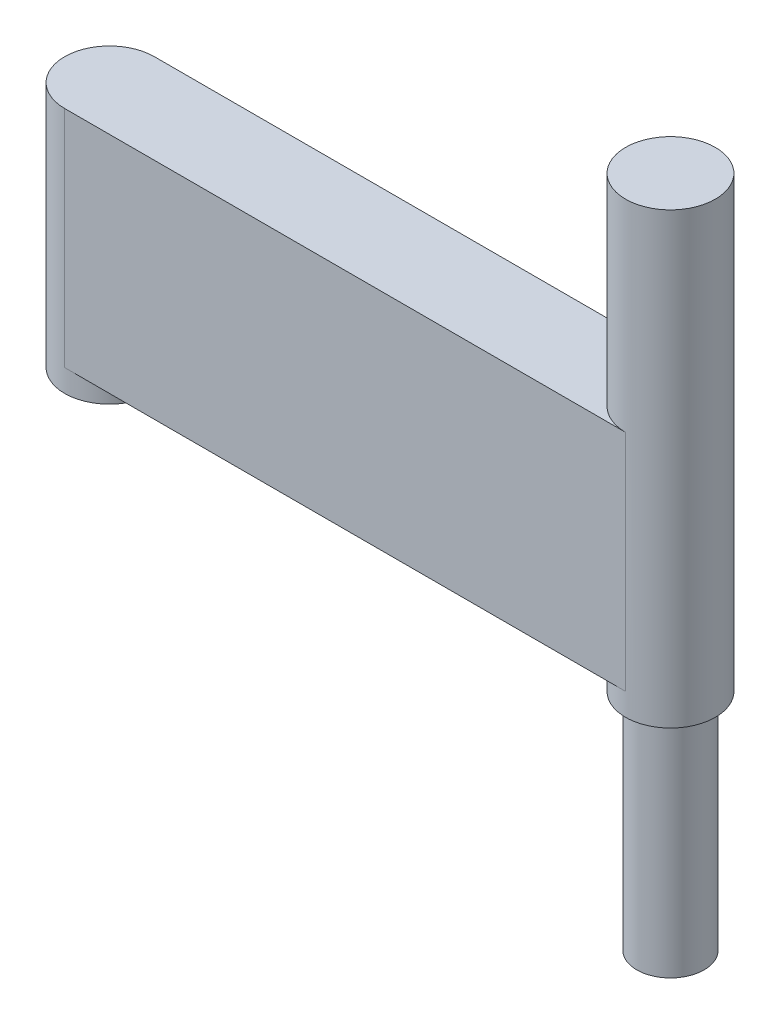
ISO-10303-21;
HEADER;
FILE_DESCRIPTION(('STEP AP214'),'2;1');
FILE_NAME('part.step','',(''),(''),'','','');
FILE_SCHEMA(('AUTOMOTIVE_DESIGN { 1 0 10303 214 1 1 1 1 }'));
ENDSEC;
DATA;
#1=APPLICATION_CONTEXT('core data for automotive mechanical design processes');
#2=APPLICATION_PROTOCOL_DEFINITION('international standard','automotive_design',2000,#1);
#3=PRODUCT_CONTEXT('',#1,'mechanical');
#4=PRODUCT('Part','Part','',(#3));
#5=PRODUCT_RELATED_PRODUCT_CATEGORY('part','',(#4));
#6=PRODUCT_DEFINITION_FORMATION('','',#4);
#7=PRODUCT_DEFINITION_CONTEXT('part definition',#1,'design');
#8=PRODUCT_DEFINITION('design','',#6,#7);
#9=PRODUCT_DEFINITION_SHAPE('','',#8);
#10=(LENGTH_UNIT() NAMED_UNIT(*) SI_UNIT(.MILLI.,.METRE.));
#11=(NAMED_UNIT(*) PLANE_ANGLE_UNIT() SI_UNIT($,.RADIAN.));
#12=(NAMED_UNIT(*) SI_UNIT($,.STERADIAN.) SOLID_ANGLE_UNIT());
#13=UNCERTAINTY_MEASURE_WITH_UNIT(LENGTH_MEASURE(1.E-05),#10,'distance_accuracy_value','');
#14=(GEOMETRIC_REPRESENTATION_CONTEXT(3) GLOBAL_UNCERTAINTY_ASSIGNED_CONTEXT((#13)) GLOBAL_UNIT_ASSIGNED_CONTEXT((#10,
#11,#12)) REPRESENTATION_CONTEXT('',''));
#15=CARTESIAN_POINT('',(0.,0.,0.));
#16=DIRECTION('',(0.,0.,1.));
#17=DIRECTION('',(1.,0.,0.));
#18=AXIS2_PLACEMENT_3D('',#15,#16,#17);
#19=CARTESIAN_POINT('',(0.,10.,0.));
#20=DIRECTION('',(0.,1.,0.));
#21=DIRECTION('',(0.,0.,1.));
#22=AXIS2_PLACEMENT_3D('',#19,#20,#21);
#23=PLANE('',#22);
#24=CARTESIAN_POINT('',(250.,10.,0.));
#25=DIRECTION('',(0.,-1.,0.));
#26=DIRECTION('',(0.,0.,-1.));
#27=AXIS2_PLACEMENT_3D('',#24,#25,#26);
#28=CIRCLE('',#27,20.);
#29=CARTESIAN_POINT('',(250.,10.,20.));
#30=VERTEX_POINT('',#29);
#31=CARTESIAN_POINT('',(250.,10.,-20.));
#32=VERTEX_POINT('',#31);
#33=EDGE_CURVE('E80',#30,#32,#28,.T.);
#34=ORIENTED_EDGE('',*,*,#33,.F.);
#35=DIRECTION('',(1.,0.,0.));
#36=VECTOR('',#35,1.);
#37=CARTESIAN_POINT('',(0.,10.,20.));
#38=LINE('',#37,#36);
#39=CARTESIAN_POINT('',(0.,10.,20.));
#40=VERTEX_POINT('',#39);
#41=EDGE_CURVE('E94',#40,#30,#38,.T.);
#42=ORIENTED_EDGE('',*,*,#41,.F.);
#43=CARTESIAN_POINT('',(0.,10.,0.));
#44=DIRECTION('',(0.,1.,0.));
#45=DIRECTION('',(0.,0.,1.));
#46=AXIS2_PLACEMENT_3D('',#43,#44,#45);
#47=CIRCLE('',#46,20.);
#48=CARTESIAN_POINT('',(0.,10.,-20.));
#49=VERTEX_POINT('',#48);
#50=EDGE_CURVE('E57',#40,#49,#47,.T.);
#51=ORIENTED_EDGE('',*,*,#50,.T.);
#52=DIRECTION('',(-1.,0.,0.));
#53=VECTOR('',#52,1.);
#54=CARTESIAN_POINT('',(0.,10.,-20.));
#55=LINE('',#54,#53);
#56=EDGE_CURVE('E121',#32,#49,#55,.T.);
#57=ORIENTED_EDGE('',*,*,#56,.F.);
#58=EDGE_LOOP('',(#34,#42,#51,#57));
#59=FACE_BOUND('',#58,.T.);
#60=ADVANCED_FACE('F39',(#59),#23,.F.);
#61=CARTESIAN_POINT('',(0.,10.,0.));
#62=DIRECTION('',(0.,-1.,0.));
#63=DIRECTION('',(0.,0.,-1.));
#64=AXIS2_PLACEMENT_3D('',#61,#62,#63);
#65=CYLINDRICAL_SURFACE('',#64,20.);
#66=ORIENTED_EDGE('',*,*,#50,.F.);
#67=DIRECTION('',(0.,-1.,0.));
#68=VECTOR('',#67,1.);
#69=CARTESIAN_POINT('',(0.,110.,20.));
#70=LINE('',#69,#68);
#71=CARTESIAN_POINT('',(0.,110.,20.));
#72=VERTEX_POINT('',#71);
#73=EDGE_CURVE('E97',#72,#40,#70,.T.);
#74=ORIENTED_EDGE('',*,*,#73,.F.);
#75=CARTESIAN_POINT('',(0.,110.,0.));
#76=DIRECTION('',(0.,1.,0.));
#77=DIRECTION('',(0.,0.,1.));
#78=AXIS2_PLACEMENT_3D('',#75,#76,#77);
#79=CIRCLE('',#78,20.);
#80=CARTESIAN_POINT('',(0.,110.,-20.));
#81=VERTEX_POINT('',#80);
#82=EDGE_CURVE('E102',#81,#72,#79,.T.);
#83=ORIENTED_EDGE('',*,*,#82,.F.);
#84=DIRECTION('',(0.,-1.,0.));
#85=VECTOR('',#84,1.);
#86=CARTESIAN_POINT('',(0.,110.,-20.));
#87=LINE('',#86,#85);
#88=EDGE_CURVE('E125',#81,#49,#87,.T.);
#89=ORIENTED_EDGE('',*,*,#88,.T.);
#90=EDGE_LOOP('',(#66,#74,#83,#89));
#91=FACE_BOUND('',#90,.T.);
#92=CARTESIAN_POINT('',(0.,0.,0.));
#93=DIRECTION('',(0.,1.,0.));
#94=DIRECTION('',(0.,0.,1.));
#95=AXIS2_PLACEMENT_3D('',#92,#93,#94);
#96=CIRCLE('',#95,20.);
#97=CARTESIAN_POINT('',(0.,0.,20.));
#98=VERTEX_POINT('',#97);
#99=EDGE_CURVE('E43',#98,#98,#96,.T.);
#100=ORIENTED_EDGE('',*,*,#99,.T.);
#101=EDGE_LOOP('',(#100));
#102=FACE_BOUND('',#101,.T.);
#103=ADVANCED_FACE('F41',(#91,#102),#65,.T.);
#104=CARTESIAN_POINT('',(0.,0.,0.));
#105=DIRECTION('',(0.,1.,0.));
#106=DIRECTION('',(0.,0.,1.));
#107=AXIS2_PLACEMENT_3D('',#104,#105,#106);
#108=PLANE('',#107);
#109=ORIENTED_EDGE('',*,*,#99,.F.);
#110=EDGE_LOOP('',(#109));
#111=FACE_BOUND('',#110,.T.);
#112=ADVANCED_FACE('F141',(#111),#108,.F.);
#113=CARTESIAN_POINT('',(0.,110.,20.));
#114=DIRECTION('',(0.,0.,-1.));
#115=DIRECTION('',(-1.,0.,0.));
#116=AXIS2_PLACEMENT_3D('',#113,#114,#115);
#117=PLANE('',#116);
#118=ORIENTED_EDGE('',*,*,#41,.T.);
#119=DIRECTION('',(0.,-1.,0.));
#120=VECTOR('',#119,1.);
#121=CARTESIAN_POINT('',(250.,110.,20.));
#122=LINE('',#121,#120);
#123=CARTESIAN_POINT('',(250.,110.,20.));
#124=VERTEX_POINT('',#123);
#125=EDGE_CURVE('E92',#124,#30,#122,.T.);
#126=ORIENTED_EDGE('',*,*,#125,.F.);
#127=DIRECTION('',(1.,0.,0.));
#128=VECTOR('',#127,1.);
#129=CARTESIAN_POINT('',(0.,110.,20.));
#130=LINE('',#129,#128);
#131=EDGE_CURVE('E87',#72,#124,#130,.T.);
#132=ORIENTED_EDGE('',*,*,#131,.F.);
#133=ORIENTED_EDGE('',*,*,#73,.T.);
#134=EDGE_LOOP('',(#118,#126,#132,#133));
#135=FACE_BOUND('',#134,.T.);
#136=ADVANCED_FACE('F93',(#135),#117,.F.);
#137=CARTESIAN_POINT('',(250.,110.,0.));
#138=DIRECTION('',(0.,-1.,0.));
#139=DIRECTION('',(0.,0.,-1.));
#140=AXIS2_PLACEMENT_3D('',#137,#138,#139);
#141=CYLINDRICAL_SURFACE('',#140,20.);
#142=ORIENTED_EDGE('',*,*,#125,.T.);
#143=ORIENTED_EDGE('',*,*,#33,.T.);
#144=DIRECTION('',(0.,-1.,0.));
#145=VECTOR('',#144,1.);
#146=CARTESIAN_POINT('',(250.,110.,-20.));
#147=LINE('',#146,#145);
#148=CARTESIAN_POINT('',(250.,110.,-20.));
#149=VERTEX_POINT('',#148);
#150=EDGE_CURVE('E98',#149,#32,#147,.T.);
#151=ORIENTED_EDGE('',*,*,#150,.F.);
#152=CARTESIAN_POINT('',(250.,110.,0.));
#153=DIRECTION('',(0.,1.,0.));
#154=DIRECTION('',(0.,0.,1.));
#155=AXIS2_PLACEMENT_3D('',#152,#153,#154);
#156=CIRCLE('',#155,20.);
#157=EDGE_CURVE('E49',#149,#124,#156,.T.);
#158=ORIENTED_EDGE('',*,*,#157,.T.);
#159=EDGE_LOOP('',(#142,#143,#151,#158));
#160=FACE_BOUND('',#159,.T.);
#161=CARTESIAN_POINT('',(250.,0.,0.));
#162=DIRECTION('',(0.,-1.,0.));
#163=DIRECTION('',(0.,0.,-1.));
#164=AXIS2_PLACEMENT_3D('',#161,#162,#163);
#165=CIRCLE('',#164,20.);
#166=CARTESIAN_POINT('',(250.,0.,-20.));
#167=VERTEX_POINT('',#166);
#168=EDGE_CURVE('E114',#167,#167,#165,.T.);
#169=ORIENTED_EDGE('',*,*,#168,.F.);
#170=EDGE_LOOP('',(#169));
#171=FACE_BOUND('',#170,.T.);
#172=CARTESIAN_POINT('',(250.,200.,0.));
#173=DIRECTION('',(0.,1.,0.));
#174=DIRECTION('',(0.,0.,1.));
#175=AXIS2_PLACEMENT_3D('',#172,#173,#174);
#176=CIRCLE('',#175,20.);
#177=CARTESIAN_POINT('',(250.,200.,20.));
#178=VERTEX_POINT('',#177);
#179=EDGE_CURVE('E113',#178,#178,#176,.T.);
#180=ORIENTED_EDGE('',*,*,#179,.F.);
#181=EDGE_LOOP('',(#180));
#182=FACE_BOUND('',#181,.T.);
#183=ADVANCED_FACE('F106',(#160,#171,#182),#141,.T.);
#184=CARTESIAN_POINT('',(0.,110.,-20.));
#185=DIRECTION('',(0.,0.,1.));
#186=DIRECTION('',(1.,0.,0.));
#187=AXIS2_PLACEMENT_3D('',#184,#185,#186);
#188=PLANE('',#187);
#189=ORIENTED_EDGE('',*,*,#56,.T.);
#190=ORIENTED_EDGE('',*,*,#88,.F.);
#191=DIRECTION('',(-1.,0.,0.));
#192=VECTOR('',#191,1.);
#193=CARTESIAN_POINT('',(0.,110.,-20.));
#194=LINE('',#193,#192);
#195=EDGE_CURVE('E66',#149,#81,#194,.T.);
#196=ORIENTED_EDGE('',*,*,#195,.F.);
#197=ORIENTED_EDGE('',*,*,#150,.T.);
#198=EDGE_LOOP('',(#189,#190,#196,#197));
#199=FACE_BOUND('',#198,.T.);
#200=ADVANCED_FACE('F156',(#199),#188,.F.);
#201=CARTESIAN_POINT('',(0.,110.,0.));
#202=DIRECTION('',(0.,1.,0.));
#203=DIRECTION('',(0.,0.,1.));
#204=AXIS2_PLACEMENT_3D('',#201,#202,#203);
#205=PLANE('',#204);
#206=ORIENTED_EDGE('',*,*,#157,.F.);
#207=ORIENTED_EDGE('',*,*,#195,.T.);
#208=ORIENTED_EDGE('',*,*,#82,.T.);
#209=ORIENTED_EDGE('',*,*,#131,.T.);
#210=EDGE_LOOP('',(#206,#207,#208,#209));
#211=FACE_BOUND('',#210,.T.);
#212=ADVANCED_FACE('F100',(#211),#205,.T.);
#213=CARTESIAN_POINT('',(250.,0.,0.));
#214=DIRECTION('',(0.,-1.,0.));
#215=DIRECTION('',(0.,0.,-1.));
#216=AXIS2_PLACEMENT_3D('',#213,#214,#215);
#217=PLANE('',#216);
#218=CARTESIAN_POINT('',(250.,0.,0.));
#219=DIRECTION('',(0.,-1.,0.));
#220=DIRECTION('',(0.,0.,-1.));
#221=AXIS2_PLACEMENT_3D('',#218,#219,#220);
#222=CIRCLE('',#221,15.);
#223=CARTESIAN_POINT('',(250.,0.,-15.));
#224=VERTEX_POINT('',#223);
#225=EDGE_CURVE('E11',#224,#224,#222,.T.);
#226=ORIENTED_EDGE('',*,*,#225,.F.);
#227=EDGE_LOOP('',(#226));
#228=FACE_BOUND('',#227,.T.);
#229=ORIENTED_EDGE('',*,*,#168,.T.);
#230=EDGE_LOOP('',(#229));
#231=FACE_BOUND('',#230,.T.);
#232=ADVANCED_FACE('F175',(#228,#231),#217,.T.);
#233=CARTESIAN_POINT('',(250.,200.,0.));
#234=DIRECTION('',(0.,1.,0.));
#235=DIRECTION('',(0.,0.,1.));
#236=AXIS2_PLACEMENT_3D('',#233,#234,#235);
#237=PLANE('',#236);
#238=ORIENTED_EDGE('',*,*,#179,.T.);
#239=EDGE_LOOP('',(#238));
#240=FACE_BOUND('',#239,.T.);
#241=ADVANCED_FACE('F182',(#240),#237,.T.);
#242=CARTESIAN_POINT('',(250.,-100.,0.));
#243=DIRECTION('',(0.,1.,0.));
#244=DIRECTION('',(0.,0.,1.));
#245=AXIS2_PLACEMENT_3D('',#242,#243,#244);
#246=CYLINDRICAL_SURFACE('',#245,15.);
#247=CARTESIAN_POINT('',(250.,-100.,0.));
#248=DIRECTION('',(0.,-1.,0.));
#249=DIRECTION('',(0.,0.,-1.));
#250=AXIS2_PLACEMENT_3D('',#247,#248,#249);
#251=CIRCLE('',#250,15.);
#252=CARTESIAN_POINT('',(250.,-100.,-15.));
#253=VERTEX_POINT('',#252);
#254=EDGE_CURVE('E250',#253,#253,#251,.T.);
#255=ORIENTED_EDGE('',*,*,#254,.F.);
#256=EDGE_LOOP('',(#255));
#257=FACE_BOUND('',#256,.T.);
#258=ORIENTED_EDGE('',*,*,#225,.T.);
#259=EDGE_LOOP('',(#258));
#260=FACE_BOUND('',#259,.T.);
#261=ADVANCED_FACE('F189',(#257,#260),#246,.T.);
#262=CARTESIAN_POINT('',(250.,-100.,0.));
#263=DIRECTION('',(0.,-1.,0.));
#264=DIRECTION('',(0.,0.,-1.));
#265=AXIS2_PLACEMENT_3D('',#262,#263,#264);
#266=PLANE('',#265);
#267=ORIENTED_EDGE('',*,*,#254,.T.);
#268=EDGE_LOOP('',(#267));
#269=FACE_BOUND('',#268,.T.);
#270=ADVANCED_FACE('F196',(#269),#266,.T.);
#271=CLOSED_SHELL('',(#60,#103,#112,#136,#183,#200,#212,#232,#241,#261,#270));
#272=MANIFOLD_SOLID_BREP('B2',#271);
#273=ADVANCED_BREP_SHAPE_REPRESENTATION('',(#18,#272),#14);
#274=SHAPE_DEFINITION_REPRESENTATION(#9,#273);
ENDSEC;
END-ISO-10303-21;
